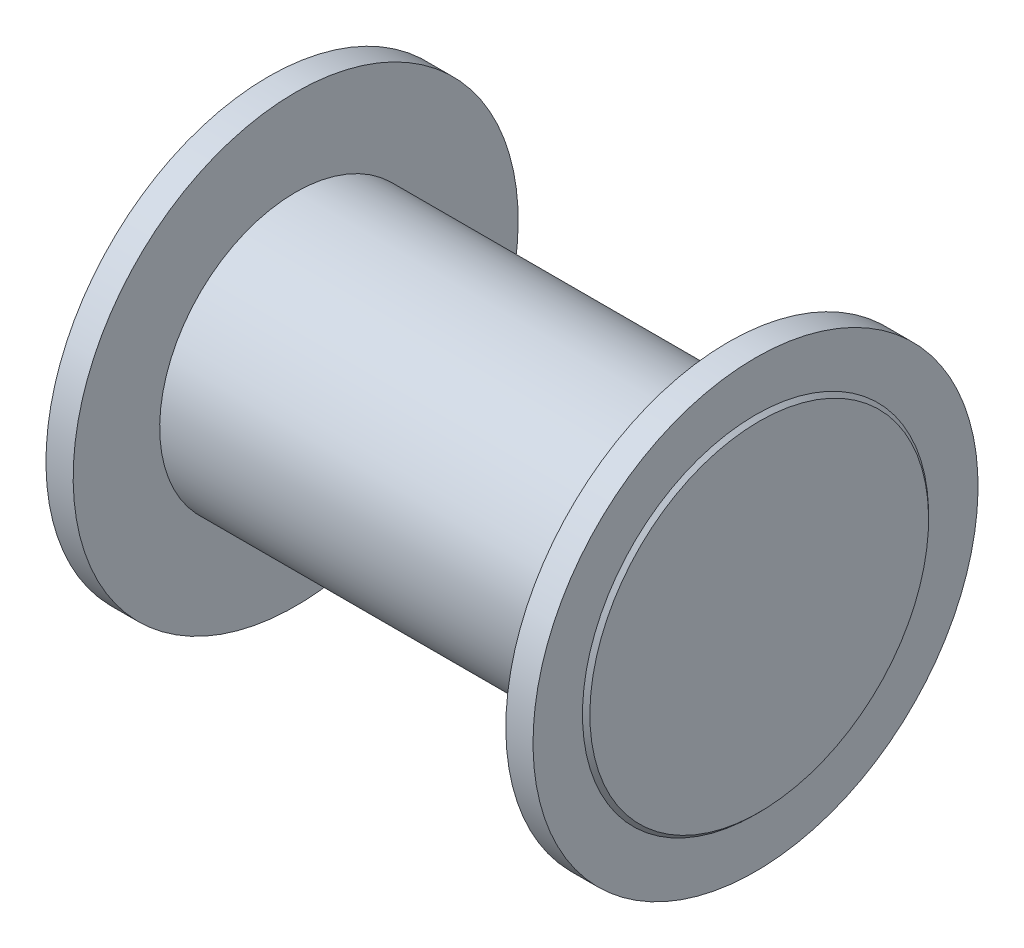
ISO-10303-21;
HEADER;
FILE_DESCRIPTION(('STEP AP214'),'2;1');
FILE_NAME('part.step','',(''),(''),'','','');
FILE_SCHEMA(('AUTOMOTIVE_DESIGN { 1 0 10303 214 1 1 1 1 }'));
ENDSEC;
DATA;
#1=APPLICATION_CONTEXT('core data for automotive mechanical design processes');
#2=APPLICATION_PROTOCOL_DEFINITION('international standard','automotive_design',2000,#1);
#3=PRODUCT_CONTEXT('',#1,'mechanical');
#4=PRODUCT('Part','Part','',(#3));
#5=PRODUCT_RELATED_PRODUCT_CATEGORY('part','',(#4));
#6=PRODUCT_DEFINITION_FORMATION('','',#4);
#7=PRODUCT_DEFINITION_CONTEXT('part definition',#1,'design');
#8=PRODUCT_DEFINITION('design','',#6,#7);
#9=PRODUCT_DEFINITION_SHAPE('','',#8);
#10=(LENGTH_UNIT() NAMED_UNIT(*) SI_UNIT(.MILLI.,.METRE.));
#11=(NAMED_UNIT(*) PLANE_ANGLE_UNIT() SI_UNIT($,.RADIAN.));
#12=(NAMED_UNIT(*) SI_UNIT($,.STERADIAN.) SOLID_ANGLE_UNIT());
#13=UNCERTAINTY_MEASURE_WITH_UNIT(LENGTH_MEASURE(1.E-05),#10,'distance_accuracy_value','');
#14=(GEOMETRIC_REPRESENTATION_CONTEXT(3) GLOBAL_UNCERTAINTY_ASSIGNED_CONTEXT((#13)) GLOBAL_UNIT_ASSIGNED_CONTEXT((#10,
#11,#12)) REPRESENTATION_CONTEXT('',''));
#15=CARTESIAN_POINT('',(0.,0.,0.));
#16=DIRECTION('',(0.,0.,1.));
#17=DIRECTION('',(1.,0.,0.));
#18=AXIS2_PLACEMENT_3D('',#15,#16,#17);
#19=CARTESIAN_POINT('',(200.,0.,0.));
#20=DIRECTION('',(1.,0.,0.));
#21=DIRECTION('',(0.,1.,0.));
#22=AXIS2_PLACEMENT_3D('',#19,#20,#21);
#23=PLANE('',#22);
#24=CARTESIAN_POINT('',(200.,0.,0.));
#25=DIRECTION('',(1.,0.,0.));
#26=DIRECTION('',(0.,1.,0.));
#27=AXIS2_PLACEMENT_3D('',#24,#25,#26);
#28=CIRCLE('',#27,137.);
#29=CARTESIAN_POINT('',(200.,137.,0.));
#30=VERTEX_POINT('',#29);
#31=EDGE_CURVE('E10',#30,#30,#28,.T.);
#32=ORIENTED_EDGE('',*,*,#31,.T.);
#33=EDGE_LOOP('',(#32));
#34=FACE_BOUND('',#33,.T.);
#35=ADVANCED_FACE('F37',(#34),#23,.T.);
#36=CARTESIAN_POINT('',(200.,0.,0.));
#37=DIRECTION('',(-1.,0.,0.));
#38=DIRECTION('',(0.,-1.,0.));
#39=AXIS2_PLACEMENT_3D('',#36,#37,#38);
#40=CONICAL_SURFACE('',#39,137.,0.785398163397448);
#41=CARTESIAN_POINT('',(197.,0.,0.));
#42=DIRECTION('',(1.,0.,0.));
#43=DIRECTION('',(0.,1.,0.));
#44=AXIS2_PLACEMENT_3D('',#41,#42,#43);
#45=CIRCLE('',#44,140.);
#46=CARTESIAN_POINT('',(197.,140.,0.));
#47=VERTEX_POINT('',#46);
#48=EDGE_CURVE('E44',#47,#47,#45,.T.);
#49=ORIENTED_EDGE('',*,*,#48,.T.);
#50=EDGE_LOOP('',(#49));
#51=FACE_BOUND('',#50,.T.);
#52=ORIENTED_EDGE('',*,*,#31,.F.);
#53=EDGE_LOOP('',(#52));
#54=FACE_BOUND('',#53,.T.);
#55=ADVANCED_FACE('F97',(#51,#54),#40,.T.);
#56=CARTESIAN_POINT('',(197.,140.,0.));
#57=DIRECTION('',(1.,0.,0.));
#58=DIRECTION('',(0.,1.,0.));
#59=AXIS2_PLACEMENT_3D('',#56,#57,#58);
#60=PLANE('',#59);
#61=CARTESIAN_POINT('',(197.,0.,0.));
#62=DIRECTION('',(1.,0.,0.));
#63=DIRECTION('',(0.,1.,0.));
#64=AXIS2_PLACEMENT_3D('',#61,#62,#63);
#65=CIRCLE('',#64,180.);
#66=CARTESIAN_POINT('',(197.,180.,0.));
#67=VERTEX_POINT('',#66);
#68=EDGE_CURVE('E49',#67,#67,#65,.T.);
#69=ORIENTED_EDGE('',*,*,#68,.T.);
#70=EDGE_LOOP('',(#69));
#71=FACE_BOUND('',#70,.T.);
#72=ORIENTED_EDGE('',*,*,#48,.F.);
#73=EDGE_LOOP('',(#72));
#74=FACE_BOUND('',#73,.T.);
#75=ADVANCED_FACE('F101',(#71,#74),#60,.T.);
#76=CARTESIAN_POINT('',(200.,0.,0.));
#77=DIRECTION('',(1.,0.,0.));
#78=DIRECTION('',(0.,1.,0.));
#79=AXIS2_PLACEMENT_3D('',#76,#77,#78);
#80=CYLINDRICAL_SURFACE('',#79,180.);
#81=CARTESIAN_POINT('',(175.,0.,0.));
#82=DIRECTION('',(1.,0.,0.));
#83=DIRECTION('',(0.,1.,0.));
#84=AXIS2_PLACEMENT_3D('',#81,#82,#83);
#85=CIRCLE('',#84,180.);
#86=CARTESIAN_POINT('',(175.,180.,0.));
#87=VERTEX_POINT('',#86);
#88=EDGE_CURVE('E54',#87,#87,#85,.T.);
#89=ORIENTED_EDGE('',*,*,#88,.T.);
#90=EDGE_LOOP('',(#89));
#91=FACE_BOUND('',#90,.T.);
#92=ORIENTED_EDGE('',*,*,#68,.F.);
#93=EDGE_LOOP('',(#92));
#94=FACE_BOUND('',#93,.T.);
#95=ADVANCED_FACE('F105',(#91,#94),#80,.T.);
#96=CARTESIAN_POINT('',(175.,180.,0.));
#97=DIRECTION('',(-1.,0.,0.));
#98=DIRECTION('',(0.,-1.,0.));
#99=AXIS2_PLACEMENT_3D('',#96,#97,#98);
#100=PLANE('',#99);
#101=CARTESIAN_POINT('',(175.,0.,0.));
#102=DIRECTION('',(1.,0.,0.));
#103=DIRECTION('',(0.,1.,0.));
#104=AXIS2_PLACEMENT_3D('',#101,#102,#103);
#105=CIRCLE('',#104,110.);
#106=CARTESIAN_POINT('',(175.,110.,0.));
#107=VERTEX_POINT('',#106);
#108=EDGE_CURVE('E60',#107,#107,#105,.T.);
#109=ORIENTED_EDGE('',*,*,#108,.T.);
#110=EDGE_LOOP('',(#109));
#111=FACE_BOUND('',#110,.T.);
#112=ORIENTED_EDGE('',*,*,#88,.F.);
#113=EDGE_LOOP('',(#112));
#114=FACE_BOUND('',#113,.T.);
#115=ADVANCED_FACE('F112',(#111,#114),#100,.T.);
#116=CARTESIAN_POINT('',(200.,0.,0.));
#117=DIRECTION('',(1.,0.,0.));
#118=DIRECTION('',(0.,1.,0.));
#119=AXIS2_PLACEMENT_3D('',#116,#117,#118);
#120=CYLINDRICAL_SURFACE('',#119,110.);
#121=CARTESIAN_POINT('',(-175.,0.,0.));
#122=DIRECTION('',(1.,0.,0.));
#123=DIRECTION('',(0.,1.,0.));
#124=AXIS2_PLACEMENT_3D('',#121,#122,#123);
#125=CIRCLE('',#124,110.);
#126=CARTESIAN_POINT('',(-175.,110.,0.));
#127=VERTEX_POINT('',#126);
#128=EDGE_CURVE('E64',#127,#127,#125,.T.);
#129=ORIENTED_EDGE('',*,*,#128,.T.);
#130=EDGE_LOOP('',(#129));
#131=FACE_BOUND('',#130,.T.);
#132=ORIENTED_EDGE('',*,*,#108,.F.);
#133=EDGE_LOOP('',(#132));
#134=FACE_BOUND('',#133,.T.);
#135=ADVANCED_FACE('F116',(#131,#134),#120,.T.);
#136=CARTESIAN_POINT('',(-175.,180.,0.));
#137=DIRECTION('',(1.,0.,0.));
#138=DIRECTION('',(0.,1.,0.));
#139=AXIS2_PLACEMENT_3D('',#136,#137,#138);
#140=PLANE('',#139);
#141=CARTESIAN_POINT('',(-175.,0.,0.));
#142=DIRECTION('',(1.,0.,0.));
#143=DIRECTION('',(0.,1.,0.));
#144=AXIS2_PLACEMENT_3D('',#141,#142,#143);
#145=CIRCLE('',#144,180.);
#146=CARTESIAN_POINT('',(-175.,180.,0.));
#147=VERTEX_POINT('',#146);
#148=EDGE_CURVE('E68',#147,#147,#145,.T.);
#149=ORIENTED_EDGE('',*,*,#148,.T.);
#150=EDGE_LOOP('',(#149));
#151=FACE_BOUND('',#150,.T.);
#152=ORIENTED_EDGE('',*,*,#128,.F.);
#153=EDGE_LOOP('',(#152));
#154=FACE_BOUND('',#153,.T.);
#155=ADVANCED_FACE('F120',(#151,#154),#140,.T.);
#156=CARTESIAN_POINT('',(200.,0.,0.));
#157=DIRECTION('',(1.,0.,0.));
#158=DIRECTION('',(0.,1.,0.));
#159=AXIS2_PLACEMENT_3D('',#156,#157,#158);
#160=CYLINDRICAL_SURFACE('',#159,180.);
#161=CARTESIAN_POINT('',(-197.,0.,0.));
#162=DIRECTION('',(1.,0.,0.));
#163=DIRECTION('',(0.,1.,0.));
#164=AXIS2_PLACEMENT_3D('',#161,#162,#163);
#165=CIRCLE('',#164,180.);
#166=CARTESIAN_POINT('',(-197.,180.,0.));
#167=VERTEX_POINT('',#166);
#168=EDGE_CURVE('E72',#167,#167,#165,.T.);
#169=ORIENTED_EDGE('',*,*,#168,.T.);
#170=EDGE_LOOP('',(#169));
#171=FACE_BOUND('',#170,.T.);
#172=ORIENTED_EDGE('',*,*,#148,.F.);
#173=EDGE_LOOP('',(#172));
#174=FACE_BOUND('',#173,.T.);
#175=ADVANCED_FACE('F124',(#171,#174),#160,.T.);
#176=CARTESIAN_POINT('',(-197.,140.,0.));
#177=DIRECTION('',(-1.,0.,0.));
#178=DIRECTION('',(0.,-1.,0.));
#179=AXIS2_PLACEMENT_3D('',#176,#177,#178);
#180=PLANE('',#179);
#181=CARTESIAN_POINT('',(-197.,0.,0.));
#182=DIRECTION('',(1.,0.,0.));
#183=DIRECTION('',(0.,1.,0.));
#184=AXIS2_PLACEMENT_3D('',#181,#182,#183);
#185=CIRCLE('',#184,140.);
#186=CARTESIAN_POINT('',(-197.,140.,0.));
#187=VERTEX_POINT('',#186);
#188=EDGE_CURVE('E76',#187,#187,#185,.T.);
#189=ORIENTED_EDGE('',*,*,#188,.T.);
#190=EDGE_LOOP('',(#189));
#191=FACE_BOUND('',#190,.T.);
#192=ORIENTED_EDGE('',*,*,#168,.F.);
#193=EDGE_LOOP('',(#192));
#194=FACE_BOUND('',#193,.T.);
#195=ADVANCED_FACE('F94',(#191,#194),#180,.T.);
#196=CARTESIAN_POINT('',(-197.,0.,0.));
#197=DIRECTION('',(1.,0.,0.));
#198=DIRECTION('',(0.,1.,0.));
#199=AXIS2_PLACEMENT_3D('',#196,#197,#198);
#200=CONICAL_SURFACE('',#199,140.,0.785398163397448);
#201=CARTESIAN_POINT('',(-200.,0.,0.));
#202=DIRECTION('',(1.,0.,0.));
#203=DIRECTION('',(0.,1.,0.));
#204=AXIS2_PLACEMENT_3D('',#201,#202,#203);
#205=CIRCLE('',#204,137.);
#206=CARTESIAN_POINT('',(-200.,137.,0.));
#207=VERTEX_POINT('',#206);
#208=EDGE_CURVE('E80',#207,#207,#205,.T.);
#209=ORIENTED_EDGE('',*,*,#208,.T.);
#210=EDGE_LOOP('',(#209));
#211=FACE_BOUND('',#210,.T.);
#212=ORIENTED_EDGE('',*,*,#188,.F.);
#213=EDGE_LOOP('',(#212));
#214=FACE_BOUND('',#213,.T.);
#215=ADVANCED_FACE('F85',(#211,#214),#200,.T.);
#216=CARTESIAN_POINT('',(-200.,0.,0.));
#217=DIRECTION('',(-1.,0.,0.));
#218=DIRECTION('',(0.,-1.,0.));
#219=AXIS2_PLACEMENT_3D('',#216,#217,#218);
#220=PLANE('',#219);
#221=ORIENTED_EDGE('',*,*,#208,.F.);
#222=EDGE_LOOP('',(#221));
#223=FACE_BOUND('',#222,.T.);
#224=ADVANCED_FACE('F88',(#223),#220,.T.);
#225=CLOSED_SHELL('',(#35,#55,#75,#95,#115,#135,#155,#175,#195,#215,#224));
#226=MANIFOLD_SOLID_BREP('B2',#225);
#227=ADVANCED_BREP_SHAPE_REPRESENTATION('',(#18,#226),#14);
#228=SHAPE_DEFINITION_REPRESENTATION(#9,#227);
ENDSEC;
END-ISO-10303-21;
